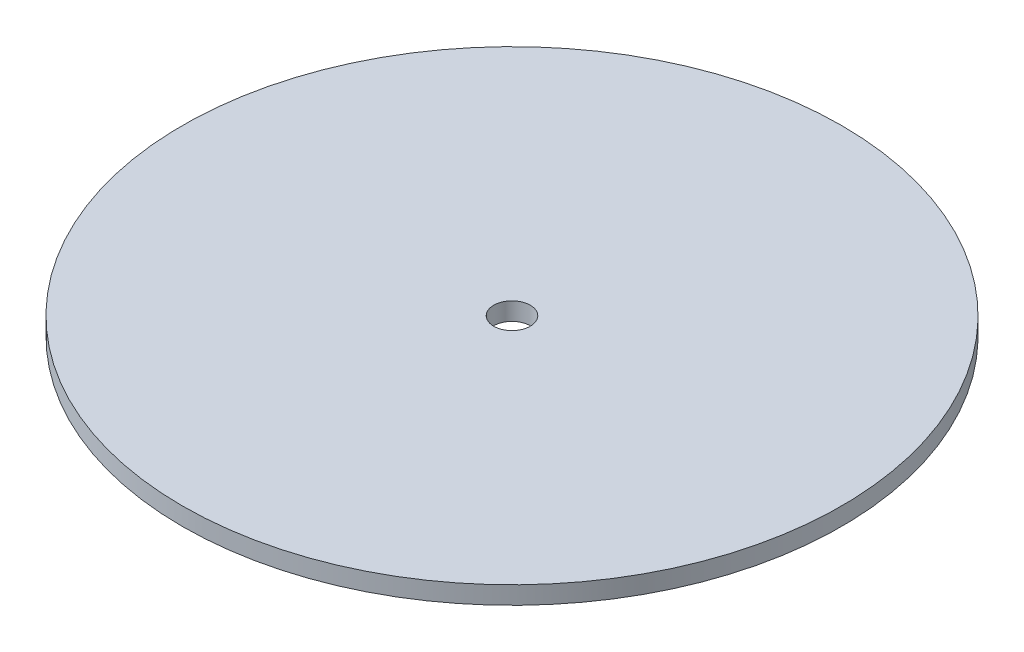
ISO-10303-21;
HEADER;
FILE_DESCRIPTION(('STEP AP214'),'2;1');
FILE_NAME('part.step','',(''),(''),'','','');
FILE_SCHEMA(('AUTOMOTIVE_DESIGN { 1 0 10303 214 1 1 1 1 }'));
ENDSEC;
DATA;
#1=APPLICATION_CONTEXT('core data for automotive mechanical design processes');
#2=APPLICATION_PROTOCOL_DEFINITION('international standard','automotive_design',2000,#1);
#3=PRODUCT_CONTEXT('',#1,'mechanical');
#4=PRODUCT('Part','Part','',(#3));
#5=PRODUCT_RELATED_PRODUCT_CATEGORY('part','',(#4));
#6=PRODUCT_DEFINITION_FORMATION('','',#4);
#7=PRODUCT_DEFINITION_CONTEXT('part definition',#1,'design');
#8=PRODUCT_DEFINITION('design','',#6,#7);
#9=PRODUCT_DEFINITION_SHAPE('','',#8);
#10=(LENGTH_UNIT() NAMED_UNIT(*) SI_UNIT(.MILLI.,.METRE.));
#11=(NAMED_UNIT(*) PLANE_ANGLE_UNIT() SI_UNIT($,.RADIAN.));
#12=(NAMED_UNIT(*) SI_UNIT($,.STERADIAN.) SOLID_ANGLE_UNIT());
#13=UNCERTAINTY_MEASURE_WITH_UNIT(LENGTH_MEASURE(1.E-05),#10,'distance_accuracy_value','');
#14=(GEOMETRIC_REPRESENTATION_CONTEXT(3) GLOBAL_UNCERTAINTY_ASSIGNED_CONTEXT((#13)) GLOBAL_UNIT_ASSIGNED_CONTEXT((#10,
#11,#12)) REPRESENTATION_CONTEXT('',''));
#15=CARTESIAN_POINT('',(0.,0.,0.));
#16=DIRECTION('',(0.,0.,1.));
#17=DIRECTION('',(1.,0.,0.));
#18=AXIS2_PLACEMENT_3D('',#15,#16,#17);
#19=CARTESIAN_POINT('',(0.,4.,0.));
#20=DIRECTION('',(0.,1.,0.));
#21=DIRECTION('',(0.,0.,1.));
#22=AXIS2_PLACEMENT_3D('',#19,#20,#21);
#23=PLANE('',#22);
#24=CARTESIAN_POINT('',(0.,4.,0.));
#25=DIRECTION('',(0.,1.,0.));
#26=DIRECTION('',(0.,0.,1.));
#27=AXIS2_PLACEMENT_3D('',#24,#25,#26);
#28=CIRCLE('',#27,74.04);
#29=CARTESIAN_POINT('',(0.,4.,74.04));
#30=VERTEX_POINT('',#29);
#31=EDGE_CURVE('E10',#30,#30,#28,.T.);
#32=ORIENTED_EDGE('',*,*,#31,.T.);
#33=EDGE_LOOP('',(#32));
#34=FACE_BOUND('',#33,.T.);
#35=CARTESIAN_POINT('',(0.,4.,0.));
#36=DIRECTION('',(0.,1.,0.));
#37=DIRECTION('',(0.,0.,1.));
#38=AXIS2_PLACEMENT_3D('',#35,#36,#37);
#39=CIRCLE('',#38,4.1);
#40=CARTESIAN_POINT('',(0.,4.,4.1));
#41=VERTEX_POINT('',#40);
#42=EDGE_CURVE('E48',#41,#41,#39,.T.);
#43=ORIENTED_EDGE('',*,*,#42,.F.);
#44=EDGE_LOOP('',(#43));
#45=FACE_BOUND('',#44,.T.);
#46=ADVANCED_FACE('F37',(#34,#45),#23,.T.);
#47=CARTESIAN_POINT('',(0.,0.,0.));
#48=DIRECTION('',(0.,1.,0.));
#49=DIRECTION('',(0.,0.,1.));
#50=AXIS2_PLACEMENT_3D('',#47,#48,#49);
#51=PLANE('',#50);
#52=CARTESIAN_POINT('',(0.,0.,0.));
#53=DIRECTION('',(0.,1.,0.));
#54=DIRECTION('',(0.,0.,1.));
#55=AXIS2_PLACEMENT_3D('',#52,#53,#54);
#56=CIRCLE('',#55,74.04);
#57=CARTESIAN_POINT('',(0.,0.,74.04));
#58=VERTEX_POINT('',#57);
#59=EDGE_CURVE('E41',#58,#58,#56,.T.);
#60=ORIENTED_EDGE('',*,*,#59,.F.);
#61=EDGE_LOOP('',(#60));
#62=FACE_BOUND('',#61,.T.);
#63=CARTESIAN_POINT('',(0.,0.,0.));
#64=DIRECTION('',(0.,1.,0.));
#65=DIRECTION('',(0.,0.,1.));
#66=AXIS2_PLACEMENT_3D('',#63,#64,#65);
#67=CIRCLE('',#66,4.1);
#68=CARTESIAN_POINT('',(0.,0.,4.1));
#69=VERTEX_POINT('',#68);
#70=EDGE_CURVE('E50',#69,#69,#67,.T.);
#71=ORIENTED_EDGE('',*,*,#70,.T.);
#72=EDGE_LOOP('',(#71));
#73=FACE_BOUND('',#72,.T.);
#74=ADVANCED_FACE('F60',(#62,#73),#51,.F.);
#75=CARTESIAN_POINT('',(0.,4.,0.));
#76=DIRECTION('',(0.,-1.,0.));
#77=DIRECTION('',(0.,0.,-1.));
#78=AXIS2_PLACEMENT_3D('',#75,#76,#77);
#79=CYLINDRICAL_SURFACE('',#78,74.04);
#80=ORIENTED_EDGE('',*,*,#31,.F.);
#81=EDGE_LOOP('',(#80));
#82=FACE_BOUND('',#81,.T.);
#83=ORIENTED_EDGE('',*,*,#59,.T.);
#84=EDGE_LOOP('',(#83));
#85=FACE_BOUND('',#84,.T.);
#86=ADVANCED_FACE('F39',(#82,#85),#79,.T.);
#87=CARTESIAN_POINT('',(0.,4.,0.));
#88=DIRECTION('',(0.,-1.,0.));
#89=DIRECTION('',(0.,0.,-1.));
#90=AXIS2_PLACEMENT_3D('',#87,#88,#89);
#91=CYLINDRICAL_SURFACE('',#90,4.1);
#92=ORIENTED_EDGE('',*,*,#42,.T.);
#93=EDGE_LOOP('',(#92));
#94=FACE_BOUND('',#93,.T.);
#95=ORIENTED_EDGE('',*,*,#70,.F.);
#96=EDGE_LOOP('',(#95));
#97=FACE_BOUND('',#96,.T.);
#98=ADVANCED_FACE('F56',(#94,#97),#91,.F.);
#99=CLOSED_SHELL('',(#46,#74,#86,#98));
#100=MANIFOLD_SOLID_BREP('B2',#99);
#101=ADVANCED_BREP_SHAPE_REPRESENTATION('',(#18,#100),#14);
#102=SHAPE_DEFINITION_REPRESENTATION(#9,#101);
ENDSEC;
END-ISO-10303-21;
